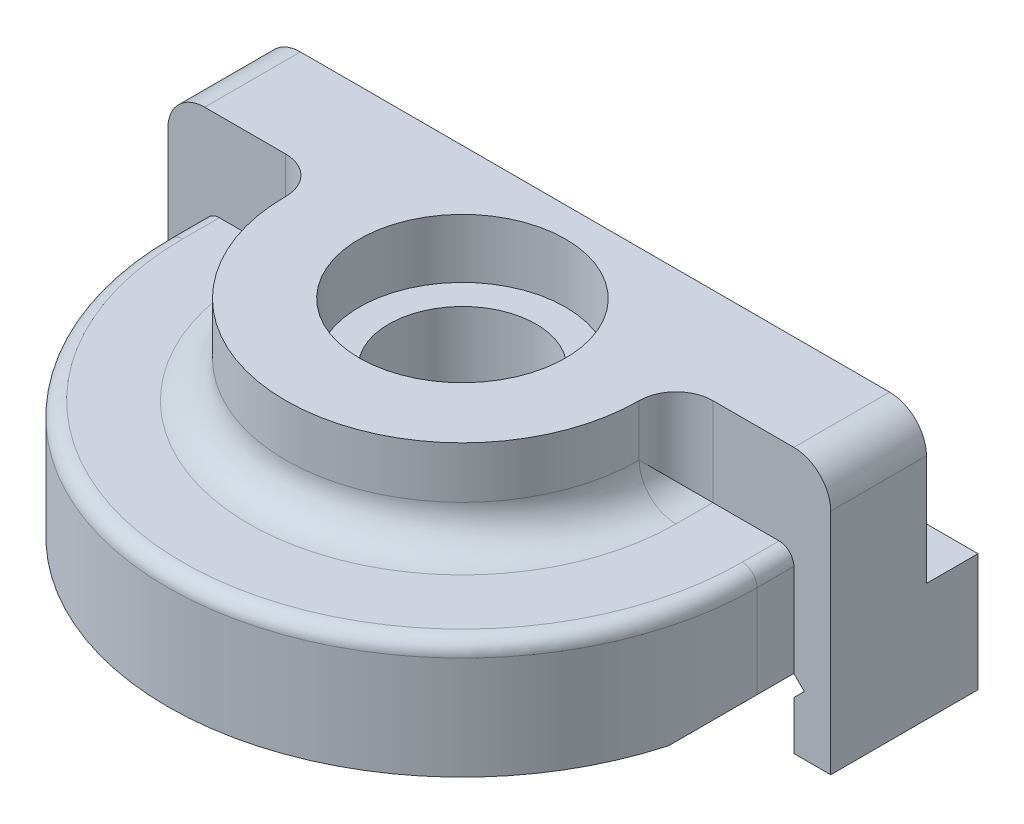
ISO-10303-21;
HEADER;
FILE_DESCRIPTION(('STEP AP214'),'2;1');
FILE_NAME('part.step','',(''),(''),'','','');
FILE_SCHEMA(('AUTOMOTIVE_DESIGN { 1 0 10303 214 1 1 1 1 }'));
ENDSEC;
DATA;
#1=APPLICATION_CONTEXT('core data for automotive mechanical design processes');
#2=APPLICATION_PROTOCOL_DEFINITION('international standard','automotive_design',2000,#1);
#3=PRODUCT_CONTEXT('',#1,'mechanical');
#4=PRODUCT('Part','Part','',(#3));
#5=PRODUCT_RELATED_PRODUCT_CATEGORY('part','',(#4));
#6=PRODUCT_DEFINITION_FORMATION('','',#4);
#7=PRODUCT_DEFINITION_CONTEXT('part definition',#1,'design');
#8=PRODUCT_DEFINITION('design','',#6,#7);
#9=PRODUCT_DEFINITION_SHAPE('','',#8);
#10=(LENGTH_UNIT() NAMED_UNIT(*) SI_UNIT(.MILLI.,.METRE.));
#11=(NAMED_UNIT(*) PLANE_ANGLE_UNIT() SI_UNIT($,.RADIAN.));
#12=(NAMED_UNIT(*) SI_UNIT($,.STERADIAN.) SOLID_ANGLE_UNIT());
#13=UNCERTAINTY_MEASURE_WITH_UNIT(LENGTH_MEASURE(1.E-05),#10,'distance_accuracy_value','');
#14=(GEOMETRIC_REPRESENTATION_CONTEXT(3) GLOBAL_UNCERTAINTY_ASSIGNED_CONTEXT((#13)) GLOBAL_UNIT_ASSIGNED_CONTEXT((#10,
#11,#12)) REPRESENTATION_CONTEXT('',''));
#15=CARTESIAN_POINT('',(0.,0.,0.));
#16=DIRECTION('',(0.,0.,1.));
#17=DIRECTION('',(1.,0.,0.));
#18=AXIS2_PLACEMENT_3D('',#15,#16,#17);
#19=CARTESIAN_POINT('',(0.,16.,0.));
#20=DIRECTION('',(0.,-1.,0.));
#21=DIRECTION('',(0.,0.,-1.));
#22=AXIS2_PLACEMENT_3D('',#19,#20,#21);
#23=CYLINDRICAL_SURFACE('',#22,40.);
#24=DIRECTION('',(0.,-1.,0.));
#25=VECTOR('',#24,1.);
#26=CARTESIAN_POINT('',(40.,16.,0.));
#27=LINE('',#26,#25);
#28=CARTESIAN_POINT('',(40.,14.,0.));
#29=VERTEX_POINT('',#28);
#30=CARTESIAN_POINT('',(40.,1.41421356237309,0.));
#31=VERTEX_POINT('',#30);
#32=EDGE_CURVE('E451',#29,#31,#27,.T.);
#33=ORIENTED_EDGE('',*,*,#32,.F.);
#34=CARTESIAN_POINT('',(0.,14.,0.));
#35=DIRECTION('',(0.,1.,0.));
#36=DIRECTION('',(0.,0.,1.));
#37=AXIS2_PLACEMENT_3D('',#34,#35,#36);
#38=CIRCLE('',#37,40.);
#39=CARTESIAN_POINT('',(-40.,14.,0.));
#40=VERTEX_POINT('',#39);
#41=EDGE_CURVE('E417',#29,#40,#38,.F.);
#42=ORIENTED_EDGE('',*,*,#41,.T.);
#43=DIRECTION('',(0.,-1.,0.));
#44=VECTOR('',#43,1.);
#45=CARTESIAN_POINT('',(-40.,16.,0.));
#46=LINE('',#45,#44);
#47=CARTESIAN_POINT('',(-40.,1.41421356237309,0.));
#48=VERTEX_POINT('',#47);
#49=EDGE_CURVE('E445',#40,#48,#46,.T.);
#50=ORIENTED_EDGE('',*,*,#49,.T.);
#51=CARTESIAN_POINT('',(0.,-38.5857864376268,0.));
#52=DIRECTION('',(0.707106781186546,0.707106781186549,0.));
#53=DIRECTION('',(0.707106781186549,-0.707106781186546,0.));
#54=AXIS2_PLACEMENT_3D('',#51,#52,#53);
#55=ELLIPSE('',#54,56.5685424949237,40.);
#56=CARTESIAN_POINT('',(-38.5857864376269,0.,10.5421575111477));
#57=VERTEX_POINT('',#56);
#58=EDGE_CURVE('E267',#48,#57,#55,.T.);
#59=ORIENTED_EDGE('',*,*,#58,.T.);
#60=CARTESIAN_POINT('',(0.,0.,0.));
#61=DIRECTION('',(0.,1.,0.));
#62=DIRECTION('',(0.,0.,1.));
#63=AXIS2_PLACEMENT_3D('',#60,#61,#62);
#64=CIRCLE('',#63,40.);
#65=CARTESIAN_POINT('',(38.5857864376269,0.,10.5421575111477));
#66=VERTEX_POINT('',#65);
#67=EDGE_CURVE('E391',#57,#66,#64,.T.);
#68=ORIENTED_EDGE('',*,*,#67,.T.);
#69=CARTESIAN_POINT('',(0.,-38.5857864376268,0.));
#70=DIRECTION('',(0.707106781186546,-0.707106781186549,0.));
#71=DIRECTION('',(-0.707106781186549,-0.707106781186546,0.));
#72=AXIS2_PLACEMENT_3D('',#69,#70,#71);
#73=ELLIPSE('',#72,56.5685424949237,40.);
#74=EDGE_CURVE('E295',#31,#66,#73,.T.);
#75=ORIENTED_EDGE('',*,*,#74,.F.);
#76=EDGE_LOOP('',(#33,#42,#50,#59,#68,#75));
#77=FACE_BOUND('',#76,.T.);
#78=ADVANCED_FACE('F43',(#77),#23,.T.);
#79=CARTESIAN_POINT('',(40.,16.,-5.00000000000001));
#80=DIRECTION('',(-1.,0.,0.));
#81=DIRECTION('',(0.,0.,1.));
#82=AXIS2_PLACEMENT_3D('',#79,#80,#81);
#83=PLANE('',#82);
#84=DIRECTION('',(0.,-1.,0.));
#85=VECTOR('',#84,1.);
#86=CARTESIAN_POINT('',(40.,16.,-5.00000000000001));
#87=LINE('',#86,#85);
#88=CARTESIAN_POINT('',(40.,14.,-5.00000000000001));
#89=VERTEX_POINT('',#88);
#90=CARTESIAN_POINT('',(40.,1.41421356237309,-5.));
#91=VERTEX_POINT('',#90);
#92=EDGE_CURVE('E450',#89,#91,#87,.T.);
#93=ORIENTED_EDGE('',*,*,#92,.F.);
#94=DIRECTION('',(0.,0.,-1.));
#95=VECTOR('',#94,1.);
#96=CARTESIAN_POINT('',(40.,14.,0.));
#97=LINE('',#96,#95);
#98=EDGE_CURVE('E415',#89,#29,#97,.F.);
#99=ORIENTED_EDGE('',*,*,#98,.T.);
#100=ORIENTED_EDGE('',*,*,#32,.T.);
#101=DIRECTION('',(0.,0.,-1.));
#102=VECTOR('',#101,1.);
#103=CARTESIAN_POINT('',(40.,1.41421356237309,40.));
#104=LINE('',#103,#102);
#105=EDGE_CURVE('E285',#31,#91,#104,.T.);
#106=ORIENTED_EDGE('',*,*,#105,.T.);
#107=EDGE_LOOP('',(#93,#99,#100,#106));
#108=FACE_BOUND('',#107,.T.);
#109=ADVANCED_FACE('F531',(#108),#83,.F.);
#110=CARTESIAN_POINT('',(0.,0.,0.));
#111=DIRECTION('',(0.,1.,0.));
#112=DIRECTION('',(0.,0.,1.));
#113=AXIS2_PLACEMENT_3D('',#110,#111,#112);
#114=PLANE('',#113);
#115=CARTESIAN_POINT('',(0.,0.,0.));
#116=DIRECTION('',(0.,1.,0.));
#117=DIRECTION('',(0.,0.,1.));
#118=AXIS2_PLACEMENT_3D('',#115,#116,#117);
#119=CIRCLE('',#118,10.);
#120=CARTESIAN_POINT('',(0.,0.,10.));
#121=VERTEX_POINT('',#120);
#122=EDGE_CURVE('E337',#121,#121,#119,.T.);
#123=ORIENTED_EDGE('',*,*,#122,.T.);
#124=EDGE_LOOP('',(#123));
#125=FACE_BOUND('',#124,.T.);
#126=ORIENTED_EDGE('',*,*,#67,.F.);
#127=DIRECTION('',(0.,0.,-1.));
#128=VECTOR('',#127,1.);
#129=CARTESIAN_POINT('',(-38.5857864376269,0.,40.));
#130=LINE('',#129,#128);
#131=CARTESIAN_POINT('',(-38.5857864376269,0.,-25.));
#132=VERTEX_POINT('',#131);
#133=EDGE_CURVE('E270',#57,#132,#130,.T.);
#134=ORIENTED_EDGE('',*,*,#133,.T.);
#135=DIRECTION('',(-1.,0.,0.));
#136=VECTOR('',#135,1.);
#137=CARTESIAN_POINT('',(40.,0.,-25.));
#138=LINE('',#137,#136);
#139=CARTESIAN_POINT('',(38.5857864376269,0.,-25.));
#140=VERTEX_POINT('',#139);
#141=EDGE_CURVE('E262',#140,#132,#138,.T.);
#142=ORIENTED_EDGE('',*,*,#141,.F.);
#143=DIRECTION('',(0.,0.,-1.));
#144=VECTOR('',#143,1.);
#145=CARTESIAN_POINT('',(38.5857864376269,0.,40.));
#146=LINE('',#145,#144);
#147=EDGE_CURVE('E286',#66,#140,#146,.T.);
#148=ORIENTED_EDGE('',*,*,#147,.F.);
#149=EDGE_LOOP('',(#126,#134,#142,#148));
#150=FACE_BOUND('',#149,.T.);
#151=ADVANCED_FACE('F588',(#125,#150),#114,.F.);
#152=CARTESIAN_POINT('',(-40.,23.,-5.));
#153=DIRECTION('',(0.,0.,-1.));
#154=DIRECTION('',(-1.,0.,0.));
#155=AXIS2_PLACEMENT_3D('',#152,#153,#154);
#156=PLANE('',#155);
#157=DIRECTION('',(1.,0.,0.));
#158=VECTOR('',#157,1.);
#159=CARTESIAN_POINT('',(-40.,28.,-5.));
#160=LINE('',#159,#158);
#161=CARTESIAN_POINT('',(29.,28.,-5.));
#162=VERTEX_POINT('',#161);
#163=CARTESIAN_POINT('',(40.,28.,-5.));
#164=VERTEX_POINT('',#163);
#165=EDGE_CURVE('E369',#162,#164,#160,.T.);
#166=ORIENTED_EDGE('',*,*,#165,.F.);
#167=DIRECTION('',(0.,-1.,0.));
#168=VECTOR('',#167,1.);
#169=CARTESIAN_POINT('',(29.,16.,-5.));
#170=LINE('',#169,#168);
#171=CARTESIAN_POINT('',(29.,16.,-5.));
#172=VERTEX_POINT('',#171);
#173=EDGE_CURVE('E541',#162,#172,#170,.T.);
#174=ORIENTED_EDGE('',*,*,#173,.T.);
#175=DIRECTION('',(-1.,0.,0.));
#176=VECTOR('',#175,1.);
#177=CARTESIAN_POINT('',(40.,16.,-5.00000000000001));
#178=LINE('',#177,#176);
#179=CARTESIAN_POINT('',(38.,16.,-5.00000000000001));
#180=VERTEX_POINT('',#179);
#181=EDGE_CURVE('E401',#180,#172,#178,.T.);
#182=ORIENTED_EDGE('',*,*,#181,.F.);
#183=CARTESIAN_POINT('',(38.,14.,-5.00000000000001));
#184=DIRECTION('',(0.,0.,-1.));
#185=DIRECTION('',(-1.,0.,0.));
#186=AXIS2_PLACEMENT_3D('',#183,#184,#185);
#187=CIRCLE('',#186,2.);
#188=EDGE_CURVE('E421',#180,#89,#187,.T.);
#189=ORIENTED_EDGE('',*,*,#188,.T.);
#190=ORIENTED_EDGE('',*,*,#92,.T.);
#191=DIRECTION('',(-0.707106781186548,0.707106781186547,0.));
#192=VECTOR('',#191,1.);
#193=CARTESIAN_POINT('',(-10.7928932188135,52.2071067811865,-5.));
#194=LINE('',#193,#192);
#195=CARTESIAN_POINT('',(41.4142135623731,0.,-5.));
#196=VERTEX_POINT('',#195);
#197=EDGE_CURVE('E298',#196,#91,#194,.T.);
#198=ORIENTED_EDGE('',*,*,#197,.F.);
#199=DIRECTION('',(0.707106781186549,0.707106781186546,0.));
#200=VECTOR('',#199,1.);
#201=CARTESIAN_POINT('',(12.2071067811864,-29.2071067811866,-5.));
#202=LINE('',#201,#200);
#203=CARTESIAN_POINT('',(40.,-1.41421356237311,-5.00000000000001));
#204=VERTEX_POINT('',#203);
#205=EDGE_CURVE('E293',#204,#196,#202,.T.);
#206=ORIENTED_EDGE('',*,*,#205,.F.);
#207=DIRECTION('',(0.,1.,0.));
#208=VECTOR('',#207,1.);
#209=CARTESIAN_POINT('',(40.,0.,-5.00000000000001));
#210=LINE('',#209,#208);
#211=CARTESIAN_POINT('',(40.,-8.00000000000001,-5.00000000000001));
#212=VERTEX_POINT('',#211);
#213=EDGE_CURVE('E345',#212,#204,#210,.T.);
#214=ORIENTED_EDGE('',*,*,#213,.F.);
#215=DIRECTION('',(-1.,0.,0.));
#216=VECTOR('',#215,1.);
#217=CARTESIAN_POINT('',(45.,-8.00000000000001,-5.00000000000001));
#218=LINE('',#217,#216);
#219=CARTESIAN_POINT('',(45.,-8.00000000000001,-5.00000000000001));
#220=VERTEX_POINT('',#219);
#221=EDGE_CURVE('E510',#220,#212,#218,.T.);
#222=ORIENTED_EDGE('',*,*,#221,.F.);
#223=DIRECTION('',(0.,-1.,0.));
#224=VECTOR('',#223,1.);
#225=CARTESIAN_POINT('',(45.,23.,-5.00000000000001));
#226=LINE('',#225,#224);
#227=CARTESIAN_POINT('',(45.,23.,-5.00000000000001));
#228=VERTEX_POINT('',#227);
#229=EDGE_CURVE('E502',#228,#220,#226,.T.);
#230=ORIENTED_EDGE('',*,*,#229,.F.);
#231=CARTESIAN_POINT('',(40.,23.,-5.));
#232=DIRECTION('',(0.,0.,-1.));
#233=DIRECTION('',(1.,0.,0.));
#234=AXIS2_PLACEMENT_3D('',#231,#232,#233);
#235=CIRCLE('',#234,5.);
#236=EDGE_CURVE('E372',#164,#228,#235,.T.);
#237=ORIENTED_EDGE('',*,*,#236,.F.);
#238=EDGE_LOOP('',(#166,#174,#182,#189,#190,#198,#206,#214,#222,#230,#237));
#239=FACE_BOUND('',#238,.T.);
#240=ADVANCED_FACE('F525',(#239),#156,.F.);
#241=CARTESIAN_POINT('',(40.,0.,-25.));
#242=DIRECTION('',(1.,0.,0.));
#243=DIRECTION('',(0.,0.,-1.));
#244=AXIS2_PLACEMENT_3D('',#241,#242,#243);
#245=PLANE('',#244);
#246=DIRECTION('',(0.,0.,-1.));
#247=VECTOR('',#246,1.);
#248=CARTESIAN_POINT('',(40.,-1.41421356237311,40.));
#249=LINE('',#248,#247);
#250=CARTESIAN_POINT('',(40.,-1.41421356237311,-25.));
#251=VERTEX_POINT('',#250);
#252=EDGE_CURVE('E288',#204,#251,#249,.T.);
#253=ORIENTED_EDGE('',*,*,#252,.T.);
#254=DIRECTION('',(0.,1.,0.));
#255=VECTOR('',#254,1.);
#256=CARTESIAN_POINT('',(40.,0.,-25.));
#257=LINE('',#256,#255);
#258=CARTESIAN_POINT('',(40.,-8.00000000000001,-25.));
#259=VERTEX_POINT('',#258);
#260=EDGE_CURVE('E356',#259,#251,#257,.T.);
#261=ORIENTED_EDGE('',*,*,#260,.F.);
#262=DIRECTION('',(0.,0.,1.));
#263=VECTOR('',#262,1.);
#264=CARTESIAN_POINT('',(40.,-8.00000000000001,-25.));
#265=LINE('',#264,#263);
#266=EDGE_CURVE('E359',#259,#212,#265,.T.);
#267=ORIENTED_EDGE('',*,*,#266,.T.);
#268=ORIENTED_EDGE('',*,*,#213,.T.);
#269=EDGE_LOOP('',(#253,#261,#267,#268));
#270=FACE_BOUND('',#269,.T.);
#271=ADVANCED_FACE('F515',(#270),#245,.F.);
#272=CARTESIAN_POINT('',(-40.,23.,-25.));
#273=DIRECTION('',(0.,0.,-1.));
#274=DIRECTION('',(-1.,0.,0.));
#275=AXIS2_PLACEMENT_3D('',#272,#273,#274);
#276=PLANE('',#275);
#277=DIRECTION('',(-0.707106781186549,0.707106781186546,0.));
#278=VECTOR('',#277,1.);
#279=CARTESIAN_POINT('',(14.9142016415554,-56.3284152039283,-25.));
#280=LINE('',#279,#278);
#281=CARTESIAN_POINT('',(-40.,-1.41421356237311,-25.));
#282=VERTEX_POINT('',#281);
#283=CARTESIAN_POINT('',(-41.4142135623731,0.,-25.));
#284=VERTEX_POINT('',#283);
#285=EDGE_CURVE('E247',#282,#284,#280,.T.);
#286=ORIENTED_EDGE('',*,*,#285,.F.);
#287=DIRECTION('',(0.,-1.,0.));
#288=VECTOR('',#287,1.);
#289=CARTESIAN_POINT('',(-40.,0.,-25.));
#290=LINE('',#289,#288);
#291=CARTESIAN_POINT('',(-40.,-8.00000000000001,-25.));
#292=VERTEX_POINT('',#291);
#293=EDGE_CURVE('E344',#282,#292,#290,.T.);
#294=ORIENTED_EDGE('',*,*,#293,.T.);
#295=DIRECTION('',(-1.,0.,0.));
#296=VECTOR('',#295,1.);
#297=CARTESIAN_POINT('',(-45.,-8.00000000000001,-25.));
#298=LINE('',#297,#296);
#299=CARTESIAN_POINT('',(-45.,-8.00000000000001,-25.));
#300=VERTEX_POINT('',#299);
#301=EDGE_CURVE('E347',#292,#300,#298,.T.);
#302=ORIENTED_EDGE('',*,*,#301,.T.);
#303=DIRECTION('',(0.,1.,0.));
#304=VECTOR('',#303,1.);
#305=CARTESIAN_POINT('',(-45.,23.,-25.));
#306=LINE('',#305,#304);
#307=CARTESIAN_POINT('',(-45.,7.99999999999997,-25.));
#308=VERTEX_POINT('',#307);
#309=EDGE_CURVE('E349',#300,#308,#306,.T.);
#310=ORIENTED_EDGE('',*,*,#309,.T.);
#311=DIRECTION('',(-1.,0.,0.));
#312=VECTOR('',#311,1.);
#313=CARTESIAN_POINT('',(45.,7.99999999999997,-25.));
#314=LINE('',#313,#312);
#315=CARTESIAN_POINT('',(45.,7.99999999999997,-25.));
#316=VERTEX_POINT('',#315);
#317=EDGE_CURVE('E324',#316,#308,#314,.T.);
#318=ORIENTED_EDGE('',*,*,#317,.F.);
#319=DIRECTION('',(0.,-1.,0.));
#320=VECTOR('',#319,1.);
#321=CARTESIAN_POINT('',(45.,23.,-25.));
#322=LINE('',#321,#320);
#323=CARTESIAN_POINT('',(45.,-8.00000000000001,-25.));
#324=VERTEX_POINT('',#323);
#325=EDGE_CURVE('E352',#316,#324,#322,.T.);
#326=ORIENTED_EDGE('',*,*,#325,.T.);
#327=DIRECTION('',(-1.,0.,0.));
#328=VECTOR('',#327,1.);
#329=CARTESIAN_POINT('',(45.,-8.00000000000001,-25.));
#330=LINE('',#329,#328);
#331=EDGE_CURVE('E354',#324,#259,#330,.T.);
#332=ORIENTED_EDGE('',*,*,#331,.T.);
#333=ORIENTED_EDGE('',*,*,#260,.T.);
#334=DIRECTION('',(0.707106781186549,0.707106781186546,0.));
#335=VECTOR('',#334,1.);
#336=CARTESIAN_POINT('',(-14.9142016415554,-56.3284152039283,-25.));
#337=LINE('',#336,#335);
#338=CARTESIAN_POINT('',(41.4142135623731,0.,-25.));
#339=VERTEX_POINT('',#338);
#340=EDGE_CURVE('E277',#251,#339,#337,.T.);
#341=ORIENTED_EDGE('',*,*,#340,.T.);
#342=DIRECTION('',(-0.707106781186548,0.707106781186547,0.));
#343=VECTOR('',#342,1.);
#344=CARTESIAN_POINT('',(-14.9142016415552,56.3284152039283,-25.));
#345=LINE('',#344,#343);
#346=CARTESIAN_POINT('',(40.,1.41421356237309,-25.));
#347=VERTEX_POINT('',#346);
#348=EDGE_CURVE('E274',#339,#347,#345,.T.);
#349=ORIENTED_EDGE('',*,*,#348,.T.);
#350=DIRECTION('',(-0.707106781186549,-0.707106781186546,0.));
#351=VECTOR('',#350,1.);
#352=CARTESIAN_POINT('',(-16.3284152039285,-54.9142016415552,-25.));
#353=LINE('',#352,#351);
#354=EDGE_CURVE('E280',#347,#140,#353,.T.);
#355=ORIENTED_EDGE('',*,*,#354,.T.);
#356=ORIENTED_EDGE('',*,*,#141,.T.);
#357=DIRECTION('',(0.707106781186549,-0.707106781186546,0.));
#358=VECTOR('',#357,1.);
#359=CARTESIAN_POINT('',(16.3284152039285,-54.9142016415552,-25.));
#360=LINE('',#359,#358);
#361=CARTESIAN_POINT('',(-40.,1.41421356237309,-25.));
#362=VERTEX_POINT('',#361);
#363=EDGE_CURVE('E239',#362,#132,#360,.T.);
#364=ORIENTED_EDGE('',*,*,#363,.F.);
#365=DIRECTION('',(0.707106781186548,0.707106781186547,0.));
#366=VECTOR('',#365,1.);
#367=CARTESIAN_POINT('',(14.9142016415552,56.3284152039283,-25.));
#368=LINE('',#367,#366);
#369=EDGE_CURVE('E250',#284,#362,#368,.T.);
#370=ORIENTED_EDGE('',*,*,#369,.F.);
#371=EDGE_LOOP('',(#286,#294,#302,#310,#318,#326,#332,#333,#341,#349,#355,#356,#364,#370));
#372=FACE_BOUND('',#371,.T.);
#373=ADVANCED_FACE('F259',(#372),#276,.T.);
#374=CARTESIAN_POINT('',(0.,-8.00000000000001,0.));
#375=DIRECTION('',(0.,1.,0.));
#376=DIRECTION('',(0.,0.,1.));
#377=AXIS2_PLACEMENT_3D('',#374,#375,#376);
#378=CYLINDRICAL_SURFACE('',#377,10.);
#379=ORIENTED_EDGE('',*,*,#122,.F.);
#380=EDGE_LOOP('',(#379));
#381=FACE_BOUND('',#380,.T.);
#382=CARTESIAN_POINT('',(0.,20.,0.));
#383=DIRECTION('',(0.,1.,0.));
#384=DIRECTION('',(0.,0.,1.));
#385=AXIS2_PLACEMENT_3D('',#382,#383,#384);
#386=CIRCLE('',#385,10.);
#387=CARTESIAN_POINT('',(0.,20.,10.));
#388=VERTEX_POINT('',#387);
#389=EDGE_CURVE('E317',#388,#388,#386,.F.);
#390=ORIENTED_EDGE('',*,*,#389,.F.);
#391=EDGE_LOOP('',(#390));
#392=FACE_BOUND('',#391,.T.);
#393=ADVANCED_FACE('F812',(#381,#392),#378,.F.);
#394=CARTESIAN_POINT('',(0.,28.,0.));
#395=DIRECTION('',(0.,1.,0.));
#396=DIRECTION('',(0.,0.,1.));
#397=AXIS2_PLACEMENT_3D('',#394,#395,#396);
#398=PLANE('',#397);
#399=CARTESIAN_POINT('',(0.,28.,0.));
#400=DIRECTION('',(0.,1.,0.));
#401=DIRECTION('',(0.,0.,1.));
#402=AXIS2_PLACEMENT_3D('',#399,#400,#401);
#403=CIRCLE('',#402,14.);
#404=CARTESIAN_POINT('',(0.,28.,14.));
#405=VERTEX_POINT('',#404);
#406=EDGE_CURVE('E313',#405,#405,#403,.T.);
#407=ORIENTED_EDGE('',*,*,#406,.F.);
#408=EDGE_LOOP('',(#407));
#409=FACE_BOUND('',#408,.T.);
#410=DIRECTION('',(0.,0.,1.));
#411=VECTOR('',#410,1.);
#412=CARTESIAN_POINT('',(40.,28.,-25.));
#413=LINE('',#412,#411);
#414=CARTESIAN_POINT('',(40.,28.,-18.));
#415=VERTEX_POINT('',#414);
#416=EDGE_CURVE('E958',#415,#164,#413,.T.);
#417=ORIENTED_EDGE('',*,*,#416,.F.);
#418=DIRECTION('',(1.,0.,0.));
#419=VECTOR('',#418,1.);
#420=CARTESIAN_POINT('',(-40.,28.,-18.));
#421=LINE('',#420,#419);
#422=CARTESIAN_POINT('',(-40.,28.,-18.));
#423=VERTEX_POINT('',#422);
#424=EDGE_CURVE('E331',#423,#415,#421,.T.);
#425=ORIENTED_EDGE('',*,*,#424,.F.);
#426=DIRECTION('',(0.,0.,1.));
#427=VECTOR('',#426,1.);
#428=CARTESIAN_POINT('',(-40.,28.,-25.));
#429=LINE('',#428,#427);
#430=CARTESIAN_POINT('',(-40.,28.,-5.));
#431=VERTEX_POINT('',#430);
#432=EDGE_CURVE('E961',#423,#431,#429,.T.);
#433=ORIENTED_EDGE('',*,*,#432,.T.);
#434=CARTESIAN_POINT('',(-29.,28.,-5.));
#435=VERTEX_POINT('',#434);
#436=EDGE_CURVE('E379',#431,#435,#160,.T.);
#437=ORIENTED_EDGE('',*,*,#436,.T.);
#438=CARTESIAN_POINT('',(-29.,28.,0.));
#439=DIRECTION('',(0.,1.,0.));
#440=DIRECTION('',(0.,0.,1.));
#441=AXIS2_PLACEMENT_3D('',#438,#439,#440);
#442=CIRCLE('',#441,5.);
#443=CARTESIAN_POINT('',(-24.,28.,0.));
#444=VERTEX_POINT('',#443);
#445=EDGE_CURVE('E52',#435,#444,#442,.F.);
#446=ORIENTED_EDGE('',*,*,#445,.T.);
#447=CARTESIAN_POINT('',(0.,28.,0.));
#448=DIRECTION('',(0.,1.,0.));
#449=DIRECTION('',(0.,0.,1.));
#450=AXIS2_PLACEMENT_3D('',#447,#448,#449);
#451=CIRCLE('',#450,24.);
#452=CARTESIAN_POINT('',(24.,28.,0.));
#453=VERTEX_POINT('',#452);
#454=EDGE_CURVE('E385',#444,#453,#451,.T.);
#455=ORIENTED_EDGE('',*,*,#454,.T.);
#456=CARTESIAN_POINT('',(29.,28.,0.));
#457=DIRECTION('',(0.,1.,0.));
#458=DIRECTION('',(0.,0.,1.));
#459=AXIS2_PLACEMENT_3D('',#456,#457,#458);
#460=CIRCLE('',#459,5.);
#461=EDGE_CURVE('E11',#453,#162,#460,.F.);
#462=ORIENTED_EDGE('',*,*,#461,.T.);
#463=ORIENTED_EDGE('',*,*,#165,.T.);
#464=EDGE_LOOP('',(#417,#425,#433,#437,#446,#455,#462,#463));
#465=FACE_BOUND('',#464,.T.);
#466=ADVANCED_FACE('F805',(#409,#465),#398,.T.);
#467=CARTESIAN_POINT('',(-40.,23.,-25.));
#468=DIRECTION('',(0.,0.,1.));
#469=DIRECTION('',(1.,0.,0.));
#470=AXIS2_PLACEMENT_3D('',#467,#468,#469);
#471=CYLINDRICAL_SURFACE('',#470,5.);
#472=CARTESIAN_POINT('',(-40.,23.,-18.));
#473=DIRECTION('',(0.,0.,-1.));
#474=DIRECTION('',(-1.,0.,0.));
#475=AXIS2_PLACEMENT_3D('',#472,#473,#474);
#476=CIRCLE('',#475,5.);
#477=CARTESIAN_POINT('',(-45.,23.,-18.));
#478=VERTEX_POINT('',#477);
#479=EDGE_CURVE('E329',#478,#423,#476,.T.);
#480=ORIENTED_EDGE('',*,*,#479,.F.);
#481=DIRECTION('',(0.,0.,1.));
#482=VECTOR('',#481,1.);
#483=CARTESIAN_POINT('',(-45.,23.,-25.));
#484=LINE('',#483,#482);
#485=CARTESIAN_POINT('',(-45.,23.,-4.99999999999999));
#486=VERTEX_POINT('',#485);
#487=EDGE_CURVE('E480',#478,#486,#484,.T.);
#488=ORIENTED_EDGE('',*,*,#487,.T.);
#489=CARTESIAN_POINT('',(-40.,23.,-5.));
#490=DIRECTION('',(0.,0.,-1.));
#491=DIRECTION('',(-1.,0.,0.));
#492=AXIS2_PLACEMENT_3D('',#489,#490,#491);
#493=CIRCLE('',#492,5.);
#494=EDGE_CURVE('E366',#486,#431,#493,.T.);
#495=ORIENTED_EDGE('',*,*,#494,.T.);
#496=ORIENTED_EDGE('',*,*,#432,.F.);
#497=EDGE_LOOP('',(#480,#488,#495,#496));
#498=FACE_BOUND('',#497,.T.);
#499=ADVANCED_FACE('F798',(#498),#471,.T.);
#500=CARTESIAN_POINT('',(40.,23.,-25.));
#501=DIRECTION('',(0.,0.,1.));
#502=DIRECTION('',(1.,0.,0.));
#503=AXIS2_PLACEMENT_3D('',#500,#501,#502);
#504=CYLINDRICAL_SURFACE('',#503,5.);
#505=CARTESIAN_POINT('',(40.,23.,-18.));
#506=DIRECTION('',(0.,0.,-1.));
#507=DIRECTION('',(-1.,0.,0.));
#508=AXIS2_PLACEMENT_3D('',#505,#506,#507);
#509=CIRCLE('',#508,5.);
#510=CARTESIAN_POINT('',(45.,23.,-18.));
#511=VERTEX_POINT('',#510);
#512=EDGE_CURVE('E333',#415,#511,#509,.T.);
#513=ORIENTED_EDGE('',*,*,#512,.F.);
#514=ORIENTED_EDGE('',*,*,#416,.T.);
#515=ORIENTED_EDGE('',*,*,#236,.T.);
#516=DIRECTION('',(0.,0.,1.));
#517=VECTOR('',#516,1.);
#518=CARTESIAN_POINT('',(45.,23.,-25.));
#519=LINE('',#518,#517);
#520=EDGE_CURVE('E505',#511,#228,#519,.T.);
#521=ORIENTED_EDGE('',*,*,#520,.F.);
#522=EDGE_LOOP('',(#513,#514,#515,#521));
#523=FACE_BOUND('',#522,.T.);
#524=ADVANCED_FACE('F606',(#523),#504,.T.);
#525=CARTESIAN_POINT('',(-40.,16.,-5.));
#526=DIRECTION('',(1.,0.,0.));
#527=DIRECTION('',(0.,0.,-1.));
#528=AXIS2_PLACEMENT_3D('',#525,#526,#527);
#529=PLANE('',#528);
#530=ORIENTED_EDGE('',*,*,#49,.F.);
#531=DIRECTION('',(0.,0.,1.));
#532=VECTOR('',#531,1.);
#533=CARTESIAN_POINT('',(-40.,14.,-5.));
#534=LINE('',#533,#532);
#535=CARTESIAN_POINT('',(-40.,14.,-5.));
#536=VERTEX_POINT('',#535);
#537=EDGE_CURVE('E419',#40,#536,#534,.F.);
#538=ORIENTED_EDGE('',*,*,#537,.T.);
#539=DIRECTION('',(0.,-1.,0.));
#540=VECTOR('',#539,1.);
#541=CARTESIAN_POINT('',(-40.,16.,-5.));
#542=LINE('',#541,#540);
#543=CARTESIAN_POINT('',(-40.,1.41421356237309,-5.));
#544=VERTEX_POINT('',#543);
#545=EDGE_CURVE('E405',#536,#544,#542,.T.);
#546=ORIENTED_EDGE('',*,*,#545,.T.);
#547=DIRECTION('',(0.,0.,-1.));
#548=VECTOR('',#547,1.);
#549=CARTESIAN_POINT('',(-40.,1.41421356237309,40.));
#550=LINE('',#549,#548);
#551=EDGE_CURVE('E243',#48,#544,#550,.T.);
#552=ORIENTED_EDGE('',*,*,#551,.F.);
#553=EDGE_LOOP('',(#530,#538,#546,#552));
#554=FACE_BOUND('',#553,.T.);
#555=ADVANCED_FACE('F444',(#554),#529,.F.);
#556=CARTESIAN_POINT('',(0.,16.,0.));
#557=DIRECTION('',(0.,1.,0.));
#558=DIRECTION('',(0.,0.,1.));
#559=AXIS2_PLACEMENT_3D('',#556,#557,#558);
#560=PLANE('',#559);
#561=CARTESIAN_POINT('',(0.,16.,0.));
#562=DIRECTION('',(0.,1.,0.));
#563=DIRECTION('',(0.,0.,1.));
#564=AXIS2_PLACEMENT_3D('',#561,#562,#563);
#565=CIRCLE('',#564,29.);
#566=CARTESIAN_POINT('',(29.,16.,0.));
#567=VERTEX_POINT('',#566);
#568=CARTESIAN_POINT('',(-29.,16.,0.));
#569=VERTEX_POINT('',#568);
#570=EDGE_CURVE('E426',#567,#569,#565,.F.);
#571=ORIENTED_EDGE('',*,*,#570,.T.);
#572=DIRECTION('',(0.,0.,1.));
#573=VECTOR('',#572,1.);
#574=CARTESIAN_POINT('',(-29.,16.,0.));
#575=LINE('',#574,#573);
#576=CARTESIAN_POINT('',(-29.,16.,-5.));
#577=VERTEX_POINT('',#576);
#578=EDGE_CURVE('E546',#569,#577,#575,.F.);
#579=ORIENTED_EDGE('',*,*,#578,.T.);
#580=CARTESIAN_POINT('',(-38.,16.,-5.));
#581=VERTEX_POINT('',#580);
#582=EDGE_CURVE('E397',#577,#581,#178,.T.);
#583=ORIENTED_EDGE('',*,*,#582,.T.);
#584=DIRECTION('',(0.,0.,1.));
#585=VECTOR('',#584,1.);
#586=CARTESIAN_POINT('',(-38.,16.,0.));
#587=LINE('',#586,#585);
#588=CARTESIAN_POINT('',(-38.,16.,0.));
#589=VERTEX_POINT('',#588);
#590=EDGE_CURVE('E408',#581,#589,#587,.T.);
#591=ORIENTED_EDGE('',*,*,#590,.T.);
#592=CARTESIAN_POINT('',(0.,16.,0.));
#593=DIRECTION('',(0.,1.,0.));
#594=DIRECTION('',(0.,0.,1.));
#595=AXIS2_PLACEMENT_3D('',#592,#593,#594);
#596=CIRCLE('',#595,38.);
#597=CARTESIAN_POINT('',(38.,16.,0.));
#598=VERTEX_POINT('',#597);
#599=EDGE_CURVE('E410',#589,#598,#596,.T.);
#600=ORIENTED_EDGE('',*,*,#599,.T.);
#601=DIRECTION('',(0.,0.,-1.));
#602=VECTOR('',#601,1.);
#603=CARTESIAN_POINT('',(38.,16.,-5.00000000000001));
#604=LINE('',#603,#602);
#605=EDGE_CURVE('E412',#598,#180,#604,.T.);
#606=ORIENTED_EDGE('',*,*,#605,.T.);
#607=ORIENTED_EDGE('',*,*,#181,.T.);
#608=DIRECTION('',(0.,0.,-1.));
#609=VECTOR('',#608,1.);
#610=CARTESIAN_POINT('',(29.,16.,0.));
#611=LINE('',#610,#609);
#612=EDGE_CURVE('E562',#172,#567,#611,.F.);
#613=ORIENTED_EDGE('',*,*,#612,.T.);
#614=EDGE_LOOP('',(#571,#579,#583,#591,#600,#606,#607,#613));
#615=FACE_BOUND('',#614,.T.);
#616=ADVANCED_FACE('F538',(#615),#560,.T.);
#617=CARTESIAN_POINT('',(0.,28.,0.));
#618=DIRECTION('',(0.,-1.,0.));
#619=DIRECTION('',(0.,0.,-1.));
#620=AXIS2_PLACEMENT_3D('',#617,#618,#619);
#621=CYLINDRICAL_SURFACE('',#620,24.);
#622=DIRECTION('',(0.,-1.,0.));
#623=VECTOR('',#622,1.);
#624=CARTESIAN_POINT('',(-24.,28.,0.));
#625=LINE('',#624,#623);
#626=CARTESIAN_POINT('',(-24.,21.,0.));
#627=VERTEX_POINT('',#626);
#628=EDGE_CURVE('E389',#444,#627,#625,.T.);
#629=ORIENTED_EDGE('',*,*,#628,.T.);
#630=CARTESIAN_POINT('',(0.,21.,0.));
#631=DIRECTION('',(0.,1.,0.));
#632=DIRECTION('',(0.,0.,1.));
#633=AXIS2_PLACEMENT_3D('',#630,#631,#632);
#634=CIRCLE('',#633,24.);
#635=CARTESIAN_POINT('',(24.,21.,0.));
#636=VERTEX_POINT('',#635);
#637=EDGE_CURVE('E60',#627,#636,#634,.T.);
#638=ORIENTED_EDGE('',*,*,#637,.T.);
#639=DIRECTION('',(0.,-1.,0.));
#640=VECTOR('',#639,1.);
#641=CARTESIAN_POINT('',(24.,28.,0.));
#642=LINE('',#641,#640);
#643=EDGE_CURVE('E387',#453,#636,#642,.T.);
#644=ORIENTED_EDGE('',*,*,#643,.F.);
#645=ORIENTED_EDGE('',*,*,#454,.F.);
#646=EDGE_LOOP('',(#629,#638,#644,#645));
#647=FACE_BOUND('',#646,.T.);
#648=ADVANCED_FACE('F564',(#647),#621,.T.);
#649=CARTESIAN_POINT('',(-40.,0.,-25.));
#650=DIRECTION('',(-1.,0.,0.));
#651=DIRECTION('',(0.,-1.,0.));
#652=AXIS2_PLACEMENT_3D('',#649,#650,#651);
#653=PLANE('',#652);
#654=ORIENTED_EDGE('',*,*,#293,.F.);
#655=DIRECTION('',(0.,0.,-1.));
#656=VECTOR('',#655,1.);
#657=CARTESIAN_POINT('',(-40.,-1.41421356237311,40.));
#658=LINE('',#657,#656);
#659=CARTESIAN_POINT('',(-40.,-1.41421356237311,-5.));
#660=VERTEX_POINT('',#659);
#661=EDGE_CURVE('E268',#660,#282,#658,.T.);
#662=ORIENTED_EDGE('',*,*,#661,.F.);
#663=DIRECTION('',(0.,-1.,0.));
#664=VECTOR('',#663,1.);
#665=CARTESIAN_POINT('',(-40.,0.,-5.));
#666=LINE('',#665,#664);
#667=CARTESIAN_POINT('',(-40.,-8.00000000000001,-4.99999999999999));
#668=VERTEX_POINT('',#667);
#669=EDGE_CURVE('E341',#660,#668,#666,.T.);
#670=ORIENTED_EDGE('',*,*,#669,.T.);
#671=DIRECTION('',(0.,0.,1.));
#672=VECTOR('',#671,1.);
#673=CARTESIAN_POINT('',(-40.,-8.00000000000001,-25.));
#674=LINE('',#673,#672);
#675=EDGE_CURVE('E383',#292,#668,#674,.T.);
#676=ORIENTED_EDGE('',*,*,#675,.F.);
#677=EDGE_LOOP('',(#654,#662,#670,#676));
#678=FACE_BOUND('',#677,.T.);
#679=ADVANCED_FACE('F467',(#678),#653,.F.);
#680=CARTESIAN_POINT('',(-45.,-8.00000000000001,-25.));
#681=DIRECTION('',(0.,1.,0.));
#682=DIRECTION('',(0.,0.,1.));
#683=AXIS2_PLACEMENT_3D('',#680,#681,#682);
#684=PLANE('',#683);
#685=DIRECTION('',(-1.,0.,0.));
#686=VECTOR('',#685,1.);
#687=CARTESIAN_POINT('',(-45.,-8.00000000000001,-4.99999999999999));
#688=LINE('',#687,#686);
#689=CARTESIAN_POINT('',(-45.,-8.00000000000001,-4.99999999999999));
#690=VERTEX_POINT('',#689);
#691=EDGE_CURVE('E361',#668,#690,#688,.T.);
#692=ORIENTED_EDGE('',*,*,#691,.T.);
#693=DIRECTION('',(0.,0.,1.));
#694=VECTOR('',#693,1.);
#695=CARTESIAN_POINT('',(-45.,-8.00000000000001,-25.));
#696=LINE('',#695,#694);
#697=EDGE_CURVE('E476',#300,#690,#696,.T.);
#698=ORIENTED_EDGE('',*,*,#697,.F.);
#699=ORIENTED_EDGE('',*,*,#301,.F.);
#700=ORIENTED_EDGE('',*,*,#675,.T.);
#701=EDGE_LOOP('',(#692,#698,#699,#700));
#702=FACE_BOUND('',#701,.T.);
#703=ADVANCED_FACE('F477',(#702),#684,.F.);
#704=CARTESIAN_POINT('',(-45.,23.,-25.));
#705=DIRECTION('',(1.,0.,0.));
#706=DIRECTION('',(0.,1.,0.));
#707=AXIS2_PLACEMENT_3D('',#704,#705,#706);
#708=PLANE('',#707);
#709=DIRECTION('',(0.,1.,0.));
#710=VECTOR('',#709,1.);
#711=CARTESIAN_POINT('',(-45.,7.99999999999997,-18.));
#712=LINE('',#711,#710);
#713=CARTESIAN_POINT('',(-45.,7.99999999999997,-18.));
#714=VERTEX_POINT('',#713);
#715=EDGE_CURVE('E327',#714,#478,#712,.T.);
#716=ORIENTED_EDGE('',*,*,#715,.F.);
#717=DIRECTION('',(0.,0.,-1.));
#718=VECTOR('',#717,1.);
#719=CARTESIAN_POINT('',(-45.,7.99999999999997,-18.));
#720=LINE('',#719,#718);
#721=EDGE_CURVE('E338',#714,#308,#720,.T.);
#722=ORIENTED_EDGE('',*,*,#721,.T.);
#723=ORIENTED_EDGE('',*,*,#309,.F.);
#724=ORIENTED_EDGE('',*,*,#697,.T.);
#725=DIRECTION('',(0.,1.,0.));
#726=VECTOR('',#725,1.);
#727=CARTESIAN_POINT('',(-45.,23.,-4.99999999999999));
#728=LINE('',#727,#726);
#729=EDGE_CURVE('E363',#690,#486,#728,.T.);
#730=ORIENTED_EDGE('',*,*,#729,.T.);
#731=ORIENTED_EDGE('',*,*,#487,.F.);
#732=EDGE_LOOP('',(#716,#722,#723,#724,#730,#731));
#733=FACE_BOUND('',#732,.T.);
#734=ADVANCED_FACE('F482',(#733),#708,.F.);
#735=CARTESIAN_POINT('',(45.,23.,-25.));
#736=DIRECTION('',(-1.,0.,0.));
#737=DIRECTION('',(0.,-1.,0.));
#738=AXIS2_PLACEMENT_3D('',#735,#736,#737);
#739=PLANE('',#738);
#740=ORIENTED_EDGE('',*,*,#325,.F.);
#741=DIRECTION('',(0.,0.,-1.));
#742=VECTOR('',#741,1.);
#743=CARTESIAN_POINT('',(45.,7.99999999999997,-18.));
#744=LINE('',#743,#742);
#745=CARTESIAN_POINT('',(45.,7.99999999999997,-18.));
#746=VERTEX_POINT('',#745);
#747=EDGE_CURVE('E335',#746,#316,#744,.T.);
#748=ORIENTED_EDGE('',*,*,#747,.F.);
#749=DIRECTION('',(0.,-1.,0.));
#750=VECTOR('',#749,1.);
#751=CARTESIAN_POINT('',(45.,23.,-18.));
#752=LINE('',#751,#750);
#753=EDGE_CURVE('E320',#511,#746,#752,.T.);
#754=ORIENTED_EDGE('',*,*,#753,.F.);
#755=ORIENTED_EDGE('',*,*,#520,.T.);
#756=ORIENTED_EDGE('',*,*,#229,.T.);
#757=DIRECTION('',(0.,0.,1.));
#758=VECTOR('',#757,1.);
#759=CARTESIAN_POINT('',(45.,-8.00000000000001,-25.));
#760=LINE('',#759,#758);
#761=EDGE_CURVE('E500',#324,#220,#760,.T.);
#762=ORIENTED_EDGE('',*,*,#761,.F.);
#763=EDGE_LOOP('',(#740,#748,#754,#755,#756,#762));
#764=FACE_BOUND('',#763,.T.);
#765=ADVANCED_FACE('F495',(#764),#739,.F.);
#766=CARTESIAN_POINT('',(45.,-8.00000000000001,-25.));
#767=DIRECTION('',(0.,1.,0.));
#768=DIRECTION('',(0.,0.,1.));
#769=AXIS2_PLACEMENT_3D('',#766,#767,#768);
#770=PLANE('',#769);
#771=ORIENTED_EDGE('',*,*,#221,.T.);
#772=ORIENTED_EDGE('',*,*,#266,.F.);
#773=ORIENTED_EDGE('',*,*,#331,.F.);
#774=ORIENTED_EDGE('',*,*,#761,.T.);
#775=EDGE_LOOP('',(#771,#772,#773,#774));
#776=FACE_BOUND('',#775,.T.);
#777=ADVANCED_FACE('F507',(#776),#770,.F.);
#778=ORIENTED_EDGE('',*,*,#582,.F.);
#779=DIRECTION('',(0.,-1.,0.));
#780=VECTOR('',#779,1.);
#781=CARTESIAN_POINT('',(-29.,28.,-5.));
#782=LINE('',#781,#780);
#783=EDGE_CURVE('E544',#577,#435,#782,.F.);
#784=ORIENTED_EDGE('',*,*,#783,.T.);
#785=ORIENTED_EDGE('',*,*,#436,.F.);
#786=ORIENTED_EDGE('',*,*,#494,.F.);
#787=ORIENTED_EDGE('',*,*,#729,.F.);
#788=ORIENTED_EDGE('',*,*,#691,.F.);
#789=ORIENTED_EDGE('',*,*,#669,.F.);
#790=DIRECTION('',(-0.707106781186549,0.707106781186546,0.));
#791=VECTOR('',#790,1.);
#792=CARTESIAN_POINT('',(-52.2071067811865,10.7928932188134,-4.99999999999999));
#793=LINE('',#792,#791);
#794=CARTESIAN_POINT('',(-41.4142135623731,0.,-4.99999999999999));
#795=VERTEX_POINT('',#794);
#796=EDGE_CURVE('E456',#660,#795,#793,.T.);
#797=ORIENTED_EDGE('',*,*,#796,.T.);
#798=DIRECTION('',(0.707106781186548,0.707106781186547,0.));
#799=VECTOR('',#798,1.);
#800=CARTESIAN_POINT('',(-29.2071067811866,12.2071067811865,-5.));
#801=LINE('',#800,#799);
#802=EDGE_CURVE('E406',#795,#544,#801,.T.);
#803=ORIENTED_EDGE('',*,*,#802,.T.);
#804=ORIENTED_EDGE('',*,*,#545,.F.);
#805=CARTESIAN_POINT('',(-38.,14.,-5.));
#806=DIRECTION('',(0.,0.,-1.));
#807=DIRECTION('',(-1.,0.,0.));
#808=AXIS2_PLACEMENT_3D('',#805,#806,#807);
#809=CIRCLE('',#808,2.);
#810=EDGE_CURVE('E423',#536,#581,#809,.T.);
#811=ORIENTED_EDGE('',*,*,#810,.T.);
#812=EDGE_LOOP('',(#778,#784,#785,#786,#787,#788,#789,#797,#803,#804,#811));
#813=FACE_BOUND('',#812,.T.);
#814=ADVANCED_FACE('F448',(#813),#156,.F.);
#815=CARTESIAN_POINT('',(45.,7.99999999999997,-18.));
#816=DIRECTION('',(0.,-1.,0.));
#817=DIRECTION('',(0.,0.,-1.));
#818=AXIS2_PLACEMENT_3D('',#815,#816,#817);
#819=PLANE('',#818);
#820=ORIENTED_EDGE('',*,*,#317,.T.);
#821=ORIENTED_EDGE('',*,*,#721,.F.);
#822=DIRECTION('',(-1.,0.,0.));
#823=VECTOR('',#822,1.);
#824=CARTESIAN_POINT('',(45.,7.99999999999997,-18.));
#825=LINE('',#824,#823);
#826=EDGE_CURVE('E323',#746,#714,#825,.T.);
#827=ORIENTED_EDGE('',*,*,#826,.F.);
#828=ORIENTED_EDGE('',*,*,#747,.T.);
#829=EDGE_LOOP('',(#820,#821,#827,#828));
#830=FACE_BOUND('',#829,.T.);
#831=ADVANCED_FACE('F485',(#830),#819,.F.);
#832=CARTESIAN_POINT('',(-40.,23.,-18.));
#833=DIRECTION('',(0.,0.,-1.));
#834=DIRECTION('',(-1.,0.,0.));
#835=AXIS2_PLACEMENT_3D('',#832,#833,#834);
#836=PLANE('',#835);
#837=CARTESIAN_POINT('',(20.,19.,-18.));
#838=DIRECTION('',(0.,0.,-1.));
#839=DIRECTION('',(-1.,0.,0.));
#840=AXIS2_PLACEMENT_3D('',#837,#838,#839);
#841=CIRCLE('',#840,3.39999999999999);
#842=CARTESIAN_POINT('',(16.6,19.,-18.));
#843=VERTEX_POINT('',#842);
#844=EDGE_CURVE('E301',#843,#843,#841,.T.);
#845=ORIENTED_EDGE('',*,*,#844,.F.);
#846=EDGE_LOOP('',(#845));
#847=FACE_BOUND('',#846,.T.);
#848=CARTESIAN_POINT('',(-20.,19.,-18.));
#849=DIRECTION('',(0.,0.,-1.));
#850=DIRECTION('',(-1.,0.,0.));
#851=AXIS2_PLACEMENT_3D('',#848,#849,#850);
#852=CIRCLE('',#851,3.39999999999999);
#853=CARTESIAN_POINT('',(-23.4,19.,-18.));
#854=VERTEX_POINT('',#853);
#855=EDGE_CURVE('E307',#854,#854,#852,.T.);
#856=ORIENTED_EDGE('',*,*,#855,.F.);
#857=EDGE_LOOP('',(#856));
#858=FACE_BOUND('',#857,.T.);
#859=ORIENTED_EDGE('',*,*,#753,.T.);
#860=ORIENTED_EDGE('',*,*,#826,.T.);
#861=ORIENTED_EDGE('',*,*,#715,.T.);
#862=ORIENTED_EDGE('',*,*,#479,.T.);
#863=ORIENTED_EDGE('',*,*,#424,.T.);
#864=ORIENTED_EDGE('',*,*,#512,.T.);
#865=EDGE_LOOP('',(#859,#860,#861,#862,#863,#864));
#866=FACE_BOUND('',#865,.T.);
#867=ADVANCED_FACE('F487',(#847,#858,#866),#836,.T.);
#868=CARTESIAN_POINT('',(0.,20.,0.));
#869=DIRECTION('',(0.,1.,0.));
#870=DIRECTION('',(0.,0.,1.));
#871=AXIS2_PLACEMENT_3D('',#868,#869,#870);
#872=PLANE('',#871);
#873=CARTESIAN_POINT('',(0.,20.,0.));
#874=DIRECTION('',(0.,1.,0.));
#875=DIRECTION('',(0.,0.,1.));
#876=AXIS2_PLACEMENT_3D('',#873,#874,#875);
#877=CIRCLE('',#876,14.);
#878=CARTESIAN_POINT('',(0.,20.,14.));
#879=VERTEX_POINT('',#878);
#880=EDGE_CURVE('E314',#879,#879,#877,.T.);
#881=ORIENTED_EDGE('',*,*,#880,.T.);
#882=EDGE_LOOP('',(#881));
#883=FACE_BOUND('',#882,.T.);
#884=ORIENTED_EDGE('',*,*,#389,.T.);
#885=EDGE_LOOP('',(#884));
#886=FACE_BOUND('',#885,.T.);
#887=ADVANCED_FACE('F719',(#883,#886),#872,.T.);
#888=CARTESIAN_POINT('',(0.,20.,0.));
#889=DIRECTION('',(0.,1.,0.));
#890=DIRECTION('',(0.,0.,1.));
#891=AXIS2_PLACEMENT_3D('',#888,#889,#890);
#892=CYLINDRICAL_SURFACE('',#891,14.);
#893=ORIENTED_EDGE('',*,*,#880,.F.);
#894=EDGE_LOOP('',(#893));
#895=FACE_BOUND('',#894,.T.);
#896=ORIENTED_EDGE('',*,*,#406,.T.);
#897=EDGE_LOOP('',(#896));
#898=FACE_BOUND('',#897,.T.);
#899=ADVANCED_FACE('F710',(#895,#898),#892,.F.);
#900=CARTESIAN_POINT('',(-20.,19.,-1.74999999999999));
#901=DIRECTION('',(0.,0.,-1.));
#902=DIRECTION('',(-1.,0.,0.));
#903=AXIS2_PLACEMENT_3D('',#900,#901,#902);
#904=CONICAL_SURFACE('',#903,3.4,1.02974425867665);
#905=CARTESIAN_POINT('',(-20.,19.,0.292926104693714));
#906=VERTEX_POINT('',#905);
#907=VERTEX_LOOP('',#906);
#908=FACE_BOUND('',#907,.T.);
#909=CARTESIAN_POINT('',(-20.,19.,-1.74999999999999));
#910=DIRECTION('',(0.,0.,-1.));
#911=DIRECTION('',(-1.,0.,0.));
#912=AXIS2_PLACEMENT_3D('',#909,#910,#911);
#913=CIRCLE('',#912,3.4);
#914=CARTESIAN_POINT('',(-23.4,19.,-1.74999999999999));
#915=VERTEX_POINT('',#914);
#916=EDGE_CURVE('E310',#915,#915,#913,.T.);
#917=ORIENTED_EDGE('',*,*,#916,.T.);
#918=EDGE_LOOP('',(#917));
#919=FACE_BOUND('',#918,.T.);
#920=ADVANCED_FACE('F702',(#908,#919),#904,.F.);
#921=CARTESIAN_POINT('',(-20.,19.,-18.));
#922=DIRECTION('',(0.,0.,-1.));
#923=DIRECTION('',(-1.,0.,0.));
#924=AXIS2_PLACEMENT_3D('',#921,#922,#923);
#925=CYLINDRICAL_SURFACE('',#924,3.39999999999999);
#926=ORIENTED_EDGE('',*,*,#916,.F.);
#927=EDGE_LOOP('',(#926));
#928=FACE_BOUND('',#927,.T.);
#929=ORIENTED_EDGE('',*,*,#855,.T.);
#930=EDGE_LOOP('',(#929));
#931=FACE_BOUND('',#930,.T.);
#932=ADVANCED_FACE('F693',(#928,#931),#925,.F.);
#933=CARTESIAN_POINT('',(20.,19.,-1.75));
#934=DIRECTION('',(0.,0.,-1.));
#935=DIRECTION('',(-1.,0.,0.));
#936=AXIS2_PLACEMENT_3D('',#933,#934,#935);
#937=CONICAL_SURFACE('',#936,3.4,1.02974425867665);
#938=CARTESIAN_POINT('',(20.,19.,0.292926104693708));
#939=VERTEX_POINT('',#938);
#940=VERTEX_LOOP('',#939);
#941=FACE_BOUND('',#940,.T.);
#942=CARTESIAN_POINT('',(20.,19.,-1.75));
#943=DIRECTION('',(0.,0.,-1.));
#944=DIRECTION('',(-1.,0.,0.));
#945=AXIS2_PLACEMENT_3D('',#942,#943,#944);
#946=CIRCLE('',#945,3.4);
#947=CARTESIAN_POINT('',(16.6,19.,-1.75));
#948=VERTEX_POINT('',#947);
#949=EDGE_CURVE('E304',#948,#948,#946,.T.);
#950=ORIENTED_EDGE('',*,*,#949,.T.);
#951=EDGE_LOOP('',(#950));
#952=FACE_BOUND('',#951,.T.);
#953=ADVANCED_FACE('F684',(#941,#952),#937,.F.);
#954=CARTESIAN_POINT('',(20.,19.,-18.));
#955=DIRECTION('',(0.,0.,-1.));
#956=DIRECTION('',(-1.,0.,0.));
#957=AXIS2_PLACEMENT_3D('',#954,#955,#956);
#958=CYLINDRICAL_SURFACE('',#957,3.39999999999999);
#959=ORIENTED_EDGE('',*,*,#949,.F.);
#960=EDGE_LOOP('',(#959));
#961=FACE_BOUND('',#960,.T.);
#962=ORIENTED_EDGE('',*,*,#844,.T.);
#963=EDGE_LOOP('',(#962));
#964=FACE_BOUND('',#963,.T.);
#965=ADVANCED_FACE('F676',(#961,#964),#958,.F.);
#966=CARTESIAN_POINT('',(-14.9142016415552,56.3284152039283,40.));
#967=DIRECTION('',(-0.707106781186547,-0.707106781186548,0.));
#968=DIRECTION('',(0.707106781186548,-0.707106781186547,0.));
#969=AXIS2_PLACEMENT_3D('',#966,#967,#968);
#970=PLANE('',#969);
#971=ORIENTED_EDGE('',*,*,#197,.T.);
#972=EDGE_CURVE('E283',#91,#347,#104,.T.);
#973=ORIENTED_EDGE('',*,*,#972,.T.);
#974=ORIENTED_EDGE('',*,*,#348,.F.);
#975=DIRECTION('',(0.,0.,-1.));
#976=VECTOR('',#975,1.);
#977=CARTESIAN_POINT('',(41.4142135623731,0.,40.));
#978=LINE('',#977,#976);
#979=EDGE_CURVE('E282',#196,#339,#978,.T.);
#980=ORIENTED_EDGE('',*,*,#979,.F.);
#981=EDGE_LOOP('',(#971,#973,#974,#980));
#982=FACE_BOUND('',#981,.T.);
#983=ADVANCED_FACE('F522',(#982),#970,.T.);
#984=CARTESIAN_POINT('',(-16.3284152039285,-54.9142016415552,40.));
#985=DIRECTION('',(0.707106781186546,-0.707106781186549,0.));
#986=DIRECTION('',(0.707106781186549,0.707106781186546,0.));
#987=AXIS2_PLACEMENT_3D('',#984,#985,#986);
#988=PLANE('',#987);
#989=ORIENTED_EDGE('',*,*,#74,.T.);
#990=ORIENTED_EDGE('',*,*,#147,.T.);
#991=ORIENTED_EDGE('',*,*,#354,.F.);
#992=ORIENTED_EDGE('',*,*,#972,.F.);
#993=ORIENTED_EDGE('',*,*,#105,.F.);
#994=EDGE_LOOP('',(#989,#990,#991,#992,#993));
#995=FACE_BOUND('',#994,.T.);
#996=ADVANCED_FACE('F586',(#995),#988,.T.);
#997=CARTESIAN_POINT('',(-14.9142016415554,-56.3284152039283,40.));
#998=DIRECTION('',(-0.707106781186546,0.707106781186549,0.));
#999=DIRECTION('',(-0.707106781186549,-0.707106781186546,0.));
#1000=AXIS2_PLACEMENT_3D('',#997,#998,#999);
#1001=PLANE('',#1000);
#1002=ORIENTED_EDGE('',*,*,#205,.T.);
#1003=ORIENTED_EDGE('',*,*,#979,.T.);
#1004=ORIENTED_EDGE('',*,*,#340,.F.);
#1005=ORIENTED_EDGE('',*,*,#252,.F.);
#1006=EDGE_LOOP('',(#1002,#1003,#1004,#1005));
#1007=FACE_BOUND('',#1006,.T.);
#1008=ADVANCED_FACE('F517',(#1007),#1001,.T.);
#1009=CARTESIAN_POINT('',(14.9142016415552,56.3284152039283,40.));
#1010=DIRECTION('',(-0.707106781186547,0.707106781186548,0.));
#1011=DIRECTION('',(-0.707106781186548,-0.707106781186547,0.));
#1012=AXIS2_PLACEMENT_3D('',#1009,#1010,#1011);
#1013=PLANE('',#1012);
#1014=DIRECTION('',(0.,0.,-1.));
#1015=VECTOR('',#1014,1.);
#1016=CARTESIAN_POINT('',(-41.4142135623731,0.,40.));
#1017=LINE('',#1016,#1015);
#1018=EDGE_CURVE('E252',#795,#284,#1017,.T.);
#1019=ORIENTED_EDGE('',*,*,#1018,.T.);
#1020=ORIENTED_EDGE('',*,*,#369,.T.);
#1021=EDGE_CURVE('E235',#544,#362,#550,.T.);
#1022=ORIENTED_EDGE('',*,*,#1021,.F.);
#1023=ORIENTED_EDGE('',*,*,#802,.F.);
#1024=EDGE_LOOP('',(#1019,#1020,#1022,#1023));
#1025=FACE_BOUND('',#1024,.T.);
#1026=ADVANCED_FACE('F251',(#1025),#1013,.F.);
#1027=CARTESIAN_POINT('',(14.9142016415554,-56.3284152039283,40.));
#1028=DIRECTION('',(-0.707106781186546,-0.707106781186549,0.));
#1029=DIRECTION('',(0.707106781186549,-0.707106781186546,0.));
#1030=AXIS2_PLACEMENT_3D('',#1027,#1028,#1029);
#1031=PLANE('',#1030);
#1032=ORIENTED_EDGE('',*,*,#661,.T.);
#1033=ORIENTED_EDGE('',*,*,#285,.T.);
#1034=ORIENTED_EDGE('',*,*,#1018,.F.);
#1035=ORIENTED_EDGE('',*,*,#796,.F.);
#1036=EDGE_LOOP('',(#1032,#1033,#1034,#1035));
#1037=FACE_BOUND('',#1036,.T.);
#1038=ADVANCED_FACE('F464',(#1037),#1031,.F.);
#1039=CARTESIAN_POINT('',(16.3284152039285,-54.9142016415552,40.));
#1040=DIRECTION('',(0.707106781186546,0.707106781186549,0.));
#1041=DIRECTION('',(-0.707106781186549,0.707106781186546,0.));
#1042=AXIS2_PLACEMENT_3D('',#1039,#1040,#1041);
#1043=PLANE('',#1042);
#1044=ORIENTED_EDGE('',*,*,#551,.T.);
#1045=ORIENTED_EDGE('',*,*,#1021,.T.);
#1046=ORIENTED_EDGE('',*,*,#363,.T.);
#1047=ORIENTED_EDGE('',*,*,#133,.F.);
#1048=ORIENTED_EDGE('',*,*,#58,.F.);
#1049=EDGE_LOOP('',(#1044,#1045,#1046,#1047,#1048));
#1050=FACE_BOUND('',#1049,.T.);
#1051=ADVANCED_FACE('F237',(#1050),#1043,.F.);
#1052=CARTESIAN_POINT('',(-38.,14.,0.));
#1053=DIRECTION('',(0.,0.,-1.));
#1054=DIRECTION('',(-1.,0.,0.));
#1055=AXIS2_PLACEMENT_3D('',#1052,#1053,#1054);
#1056=CYLINDRICAL_SURFACE('',#1055,2.);
#1057=ORIENTED_EDGE('',*,*,#810,.F.);
#1058=ORIENTED_EDGE('',*,*,#537,.F.);
#1059=CARTESIAN_POINT('',(-38.,14.,0.));
#1060=DIRECTION('',(0.,0.,1.));
#1061=DIRECTION('',(1.,0.,0.));
#1062=AXIS2_PLACEMENT_3D('',#1059,#1060,#1061);
#1063=CIRCLE('',#1062,2.);
#1064=EDGE_CURVE('E256',#589,#40,#1063,.T.);
#1065=ORIENTED_EDGE('',*,*,#1064,.F.);
#1066=ORIENTED_EDGE('',*,*,#590,.F.);
#1067=EDGE_LOOP('',(#1057,#1058,#1065,#1066));
#1068=FACE_BOUND('',#1067,.T.);
#1069=ADVANCED_FACE('F440',(#1068),#1056,.T.);
#1070=CARTESIAN_POINT('',(0.,14.,0.));
#1071=DIRECTION('',(0.,1.,0.));
#1072=DIRECTION('',(0.,0.,1.));
#1073=AXIS2_PLACEMENT_3D('',#1070,#1071,#1072);
#1074=TOROIDAL_SURFACE('',#1073,38.,2.);
#1075=ORIENTED_EDGE('',*,*,#1064,.T.);
#1076=ORIENTED_EDGE('',*,*,#41,.F.);
#1077=CARTESIAN_POINT('',(38.,14.,0.));
#1078=DIRECTION('',(0.,0.,-1.));
#1079=DIRECTION('',(-1.,0.,0.));
#1080=AXIS2_PLACEMENT_3D('',#1077,#1078,#1079);
#1081=CIRCLE('',#1080,2.);
#1082=EDGE_CURVE('E427',#598,#29,#1081,.T.);
#1083=ORIENTED_EDGE('',*,*,#1082,.F.);
#1084=ORIENTED_EDGE('',*,*,#599,.F.);
#1085=EDGE_LOOP('',(#1075,#1076,#1083,#1084));
#1086=FACE_BOUND('',#1085,.T.);
#1087=ADVANCED_FACE('F434',(#1086),#1074,.T.);
#1088=CARTESIAN_POINT('',(38.,14.,0.));
#1089=DIRECTION('',(0.,0.,1.));
#1090=DIRECTION('',(1.,0.,0.));
#1091=AXIS2_PLACEMENT_3D('',#1088,#1089,#1090);
#1092=CYLINDRICAL_SURFACE('',#1091,2.);
#1093=ORIENTED_EDGE('',*,*,#1082,.T.);
#1094=ORIENTED_EDGE('',*,*,#98,.F.);
#1095=ORIENTED_EDGE('',*,*,#188,.F.);
#1096=ORIENTED_EDGE('',*,*,#605,.F.);
#1097=EDGE_LOOP('',(#1093,#1094,#1095,#1096));
#1098=FACE_BOUND('',#1097,.T.);
#1099=ADVANCED_FACE('F535',(#1098),#1092,.T.);
#1100=CARTESIAN_POINT('',(29.,23.,0.));
#1101=DIRECTION('',(0.,1.,0.));
#1102=DIRECTION('',(0.,0.,1.));
#1103=AXIS2_PLACEMENT_3D('',#1100,#1101,#1102);
#1104=CYLINDRICAL_SURFACE('',#1103,5.);
#1105=CARTESIAN_POINT('',(29.,21.,0.));
#1106=DIRECTION('',(0.,0.707106781186547,-0.707106781186547));
#1107=DIRECTION('',(0.,-0.707106781186547,-0.707106781186547));
#1108=AXIS2_PLACEMENT_3D('',#1105,#1106,#1107);
#1109=ELLIPSE('',#1108,7.07106781186547,5.);
#1110=EDGE_CURVE('E47',#172,#636,#1109,.T.);
#1111=ORIENTED_EDGE('',*,*,#1110,.F.);
#1112=ORIENTED_EDGE('',*,*,#173,.F.);
#1113=ORIENTED_EDGE('',*,*,#461,.F.);
#1114=ORIENTED_EDGE('',*,*,#643,.T.);
#1115=EDGE_LOOP('',(#1111,#1112,#1113,#1114));
#1116=FACE_BOUND('',#1115,.T.);
#1117=ADVANCED_FACE('F45',(#1116),#1104,.F.);
#1118=CARTESIAN_POINT('',(29.,21.,-5.));
#1119=DIRECTION('',(0.,0.,-1.));
#1120=DIRECTION('',(-1.,0.,0.));
#1121=AXIS2_PLACEMENT_3D('',#1118,#1119,#1120);
#1122=CYLINDRICAL_SURFACE('',#1121,5.);
#1123=ORIENTED_EDGE('',*,*,#612,.F.);
#1124=ORIENTED_EDGE('',*,*,#1110,.T.);
#1125=CARTESIAN_POINT('',(29.,21.,0.));
#1126=DIRECTION('',(0.,0.,-1.));
#1127=DIRECTION('',(-1.,0.,0.));
#1128=AXIS2_PLACEMENT_3D('',#1125,#1126,#1127);
#1129=CIRCLE('',#1128,5.);
#1130=EDGE_CURVE('E553',#567,#636,#1129,.T.);
#1131=ORIENTED_EDGE('',*,*,#1130,.F.);
#1132=EDGE_LOOP('',(#1123,#1124,#1131));
#1133=FACE_BOUND('',#1132,.T.);
#1134=ADVANCED_FACE('F561',(#1133),#1122,.F.);
#1135=CARTESIAN_POINT('',(-29.,28.,0.));
#1136=DIRECTION('',(0.,1.,0.));
#1137=DIRECTION('',(0.,0.,1.));
#1138=AXIS2_PLACEMENT_3D('',#1135,#1136,#1137);
#1139=CYLINDRICAL_SURFACE('',#1138,5.);
#1140=ORIENTED_EDGE('',*,*,#445,.F.);
#1141=ORIENTED_EDGE('',*,*,#783,.F.);
#1142=CARTESIAN_POINT('',(-29.,21.,0.));
#1143=DIRECTION('',(0.,-0.707106781186547,0.707106781186547));
#1144=DIRECTION('',(0.,0.707106781186547,0.707106781186547));
#1145=AXIS2_PLACEMENT_3D('',#1142,#1143,#1144);
#1146=ELLIPSE('',#1145,7.07106781186547,5.);
#1147=EDGE_CURVE('E552',#627,#577,#1146,.F.);
#1148=ORIENTED_EDGE('',*,*,#1147,.F.);
#1149=ORIENTED_EDGE('',*,*,#628,.F.);
#1150=EDGE_LOOP('',(#1140,#1141,#1148,#1149));
#1151=FACE_BOUND('',#1150,.T.);
#1152=ADVANCED_FACE('F569',(#1151),#1139,.F.);
#1153=CARTESIAN_POINT('',(0.,21.,0.));
#1154=DIRECTION('',(0.,1.,0.));
#1155=DIRECTION('',(0.,0.,1.));
#1156=AXIS2_PLACEMENT_3D('',#1153,#1154,#1155);
#1157=TOROIDAL_SURFACE('',#1156,29.,5.);
#1158=ORIENTED_EDGE('',*,*,#1130,.T.);
#1159=ORIENTED_EDGE('',*,*,#637,.F.);
#1160=CARTESIAN_POINT('',(-29.,21.,0.));
#1161=DIRECTION('',(0.,0.,1.));
#1162=DIRECTION('',(1.,0.,0.));
#1163=AXIS2_PLACEMENT_3D('',#1160,#1161,#1162);
#1164=CIRCLE('',#1163,5.);
#1165=EDGE_CURVE('E549',#569,#627,#1164,.T.);
#1166=ORIENTED_EDGE('',*,*,#1165,.F.);
#1167=ORIENTED_EDGE('',*,*,#570,.F.);
#1168=EDGE_LOOP('',(#1158,#1159,#1166,#1167));
#1169=FACE_BOUND('',#1168,.T.);
#1170=ADVANCED_FACE('F576',(#1169),#1157,.F.);
#1171=CARTESIAN_POINT('',(-29.,21.,-4.99999999999999));
#1172=DIRECTION('',(0.,0.,1.));
#1173=DIRECTION('',(1.,0.,0.));
#1174=AXIS2_PLACEMENT_3D('',#1171,#1172,#1173);
#1175=CYLINDRICAL_SURFACE('',#1174,5.);
#1176=ORIENTED_EDGE('',*,*,#1147,.T.);
#1177=ORIENTED_EDGE('',*,*,#578,.F.);
#1178=ORIENTED_EDGE('',*,*,#1165,.T.);
#1179=EDGE_LOOP('',(#1176,#1177,#1178));
#1180=FACE_BOUND('',#1179,.T.);
#1181=ADVANCED_FACE('F575',(#1180),#1175,.F.);
#1182=CLOSED_SHELL('',(#78,#109,#151,#240,#271,#373,#393,#466,#499,#524,#555,#616,#648,#679,
#703,#734,#765,#777,#814,#831,#867,#887,#899,#920,#932,#953,#965,#983,#996,#1008,#1026,#1038,
#1051,#1069,#1087,#1099,#1117,#1134,#1152,#1170,#1181));
#1183=MANIFOLD_SOLID_BREP('B2',#1182);
#1184=ADVANCED_BREP_SHAPE_REPRESENTATION('',(#18,#1183),#14);
#1185=SHAPE_DEFINITION_REPRESENTATION(#9,#1184);
ENDSEC;
END-ISO-10303-21;
